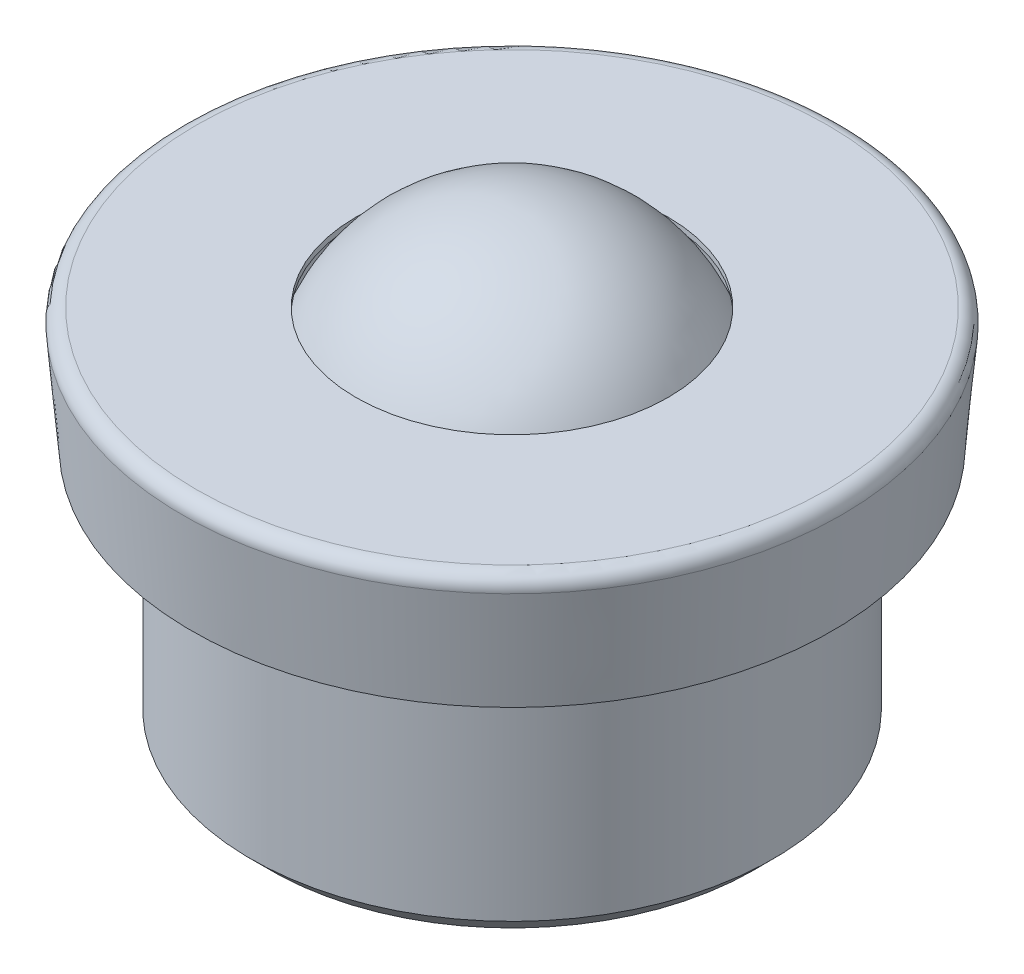
ISO-10303-21;
HEADER;
FILE_DESCRIPTION(('STEP AP214'),'2;1');
FILE_NAME('part.step','',(''),(''),'','','');
FILE_SCHEMA(('AUTOMOTIVE_DESIGN { 1 0 10303 214 1 1 1 1 }'));
ENDSEC;
DATA;
#1=APPLICATION_CONTEXT('core data for automotive mechanical design processes');
#2=APPLICATION_PROTOCOL_DEFINITION('international standard','automotive_design',2000,#1);
#3=PRODUCT_CONTEXT('',#1,'mechanical');
#4=PRODUCT('Part','Part','',(#3));
#5=PRODUCT_RELATED_PRODUCT_CATEGORY('part','',(#4));
#6=PRODUCT_DEFINITION_FORMATION('','',#4);
#7=PRODUCT_DEFINITION_CONTEXT('part definition',#1,'design');
#8=PRODUCT_DEFINITION('design','',#6,#7);
#9=PRODUCT_DEFINITION_SHAPE('','',#8);
#10=(LENGTH_UNIT() NAMED_UNIT(*) SI_UNIT(.MILLI.,.METRE.));
#11=(NAMED_UNIT(*) PLANE_ANGLE_UNIT() SI_UNIT($,.RADIAN.));
#12=(NAMED_UNIT(*) SI_UNIT($,.STERADIAN.) SOLID_ANGLE_UNIT());
#13=UNCERTAINTY_MEASURE_WITH_UNIT(LENGTH_MEASURE(1.E-05),#10,'distance_accuracy_value','');
#14=(GEOMETRIC_REPRESENTATION_CONTEXT(3) GLOBAL_UNCERTAINTY_ASSIGNED_CONTEXT((#13)) GLOBAL_UNIT_ASSIGNED_CONTEXT((#10,
#11,#12)) REPRESENTATION_CONTEXT('',''));
#15=CARTESIAN_POINT('',(0.,0.,0.));
#16=DIRECTION('',(0.,0.,1.));
#17=DIRECTION('',(1.,0.,0.));
#18=AXIS2_PLACEMENT_3D('',#15,#16,#17);
#19=CARTESIAN_POINT('',(0.,-1.5875,0.));
#20=DIRECTION('',(0.,1.,0.));
#21=DIRECTION('',(-1.,0.,0.));
#22=AXIS2_PLACEMENT_3D('',#19,#20,#21);
#23=CONICAL_SURFACE('',#22,14.1045653660544,0.78539816339745);
#24=CARTESIAN_POINT('',(0.,-1.3335,0.));
#25=DIRECTION('',(0.,1.,0.));
#26=DIRECTION('',(-1.,0.,0.));
#27=AXIS2_PLACEMENT_3D('',#24,#25,#26);
#28=CIRCLE('',#27,14.3585653660544);
#29=CARTESIAN_POINT('',(-14.3585653660544,-1.3335,0.));
#30=VERTEX_POINT('',#29);
#31=EDGE_CURVE('E55',#30,#30,#28,.T.);
#32=ORIENTED_EDGE('',*,*,#31,.F.);
#33=EDGE_LOOP('',(#32));
#34=FACE_BOUND('',#33,.T.);
#35=CARTESIAN_POINT('',(0.,-1.5875,0.));
#36=DIRECTION('',(0.,1.,0.));
#37=DIRECTION('',(-1.,0.,0.));
#38=AXIS2_PLACEMENT_3D('',#35,#36,#37);
#39=CIRCLE('',#38,14.1045653660544);
#40=CARTESIAN_POINT('',(-14.1045653660544,-1.5875,0.));
#41=VERTEX_POINT('',#40);
#42=EDGE_CURVE('E70',#41,#41,#39,.T.);
#43=ORIENTED_EDGE('',*,*,#42,.T.);
#44=EDGE_LOOP('',(#43));
#45=FACE_BOUND('',#44,.T.);
#46=ADVANCED_FACE('F44',(#34,#45),#23,.T.);
#47=CARTESIAN_POINT('',(0.,-1.3335,0.));
#48=DIRECTION('',(0.,1.,0.));
#49=DIRECTION('',(-1.,0.,0.));
#50=AXIS2_PLACEMENT_3D('',#47,#48,#49);
#51=CONICAL_SURFACE('',#50,14.3585653660544,0.0872664625997214);
#52=CARTESIAN_POINT('',(0.,3.7585,0.));
#53=DIRECTION('',(0.,1.,0.));
#54=DIRECTION('',(-1.,0.,0.));
#55=AXIS2_PLACEMENT_3D('',#52,#53,#54);
#56=CIRCLE('',#55,14.8040576407284);
#57=CARTESIAN_POINT('',(-14.8040576407284,3.7585,0.));
#58=VERTEX_POINT('',#57);
#59=EDGE_CURVE('E59',#58,#58,#56,.T.);
#60=ORIENTED_EDGE('',*,*,#59,.F.);
#61=EDGE_LOOP('',(#60));
#62=FACE_BOUND('',#61,.T.);
#63=ORIENTED_EDGE('',*,*,#31,.T.);
#64=EDGE_LOOP('',(#63));
#65=FACE_BOUND('',#64,.T.);
#66=ADVANCED_FACE('F98',(#62,#65),#51,.T.);
#67=CARTESIAN_POINT('',(9.78016789221944,3.7585,0.));
#68=DIRECTION('',(0.,-1.,0.));
#69=DIRECTION('',(1.,0.,0.));
#70=AXIS2_PLACEMENT_3D('',#67,#68,#69);
#71=PLANE('',#70);
#72=CARTESIAN_POINT('',(0.,3.7585,0.));
#73=DIRECTION('',(0.,1.,0.));
#74=DIRECTION('',(-1.,0.,0.));
#75=AXIS2_PLACEMENT_3D('',#72,#73,#74);
#76=CIRCLE('',#75,9.78016789221944);
#77=CARTESIAN_POINT('',(9.78016789221944,3.7585,0.));
#78=VERTEX_POINT('',#77);
#79=EDGE_CURVE('E64',#78,#78,#76,.T.);
#80=ORIENTED_EDGE('',*,*,#79,.F.);
#81=EDGE_LOOP('',(#80));
#82=FACE_BOUND('',#81,.T.);
#83=ORIENTED_EDGE('',*,*,#59,.T.);
#84=EDGE_LOOP('',(#83));
#85=FACE_BOUND('',#84,.T.);
#86=ADVANCED_FACE('F94',(#82,#85),#71,.F.);
#87=CARTESIAN_POINT('',(0.,0.,0.));
#88=DIRECTION('',(0.,1.,0.));
#89=DIRECTION('',(1.,0.,0.));
#90=AXIS2_PLACEMENT_3D('',#87,#88,#89);
#91=SPHERICAL_SURFACE('',#90,10.4775);
#92=CARTESIAN_POINT('',(0.,-10.4582398734204,0.));
#93=DIRECTION('',(0.,1.,0.));
#94=DIRECTION('',(-1.,0.,0.));
#95=AXIS2_PLACEMENT_3D('',#92,#93,#94);
#96=CIRCLE('',#95,0.635);
#97=CARTESIAN_POINT('',(0.635000000000021,-10.4582398734204,0.));
#98=VERTEX_POINT('',#97);
#99=EDGE_CURVE('E73',#98,#98,#96,.F.);
#100=CARTESIAN_POINT('',(0.635000000000021,-10.4582398734204,0.));
#101=CARTESIAN_POINT('',(0.839486750809069,-10.4458313385506,0.));
#102=CARTESIAN_POINT('',(1.04360772166766,-10.4274109674214,0.));
#103=CARTESIAN_POINT('',(1.45041985632431,-10.3786422729271,0.));
#104=CARTESIAN_POINT('',(1.65311102012238,-10.3482939495622,0.));
#105=CARTESIAN_POINT('',(2.05636529349838,-10.2757650708801,0.));
#106=CARTESIAN_POINT('',(2.25692840307631,-10.2335845155629,0.));
#107=CARTESIAN_POINT('',(2.65523695866007,-10.13753858698,0.));
#108=CARTESIAN_POINT('',(2.8529824046659,-10.0836732137141,0.));
#109=CARTESIAN_POINT('',(3.24497536271436,-9.96444231037557,0.));
#110=CARTESIAN_POINT('',(3.43922287475699,-9.8990767803028,0.));
#111=CARTESIAN_POINT('',(3.82355182113725,-9.75707057152275,0.));
#112=CARTESIAN_POINT('',(4.01363325547488,-9.68042989281546,0.));
#113=CARTESIAN_POINT('',(4.38897620763533,-9.51613696718456,0.));
#114=CARTESIAN_POINT('',(4.57423772545816,-9.42848472026094,0.));
#115=CARTESIAN_POINT('',(4.93930359190139,-9.24247017237625,0.));
#116=CARTESIAN_POINT('',(5.11910794052179,-9.14410787141517,0.));
#117=CARTESIAN_POINT('',(5.47264098537421,-8.93701155440526,0.));
#118=CARTESIAN_POINT('',(5.64636968160622,-8.82827753835642,0.));
#119=CARTESIAN_POINT('',(5.98715383773568,-8.60081181034217,0.));
#120=CARTESIAN_POINT('',(6.15420929763314,-8.48208009837676,0.));
#121=CARTESIAN_POINT('',(6.48107235131078,-8.23502738622897,0.));
#122=CARTESIAN_POINT('',(6.64087994509096,-8.10670638604658,0.));
#123=CARTESIAN_POINT('',(6.9526975676658,-7.840916490253,0.));
#124=CARTESIAN_POINT('',(7.10470759646045,-7.7034475946418,0.));
#125=CARTESIAN_POINT('',(7.40040721189516,-7.41983476721413,0.));
#126=CARTESIAN_POINT('',(7.5440967985352,-7.27369083539767,0.));
#127=CARTESIAN_POINT('',(7.82266127277172,-6.97323063479805,0.));
#128=CARTESIAN_POINT('',(7.95753616036819,-6.81891436601489,0.));
#129=CARTESIAN_POINT('',(8.21800730002785,-6.50264030154696,0.));
#130=CARTESIAN_POINT('',(8.34360355209103,-6.34068250586219,0.));
#131=CARTESIAN_POINT('',(8.58508540042208,-6.00968248263351,0.));
#132=CARTESIAN_POINT('',(8.70097099668995,-5.84064025508959,0.));
#133=CARTESIAN_POINT('',(8.92263291543938,-5.4960528318904,0.));
#134=CARTESIAN_POINT('',(9.02840923792094,-5.32050763623513,0.));
#135=CARTESIAN_POINT('',(9.22948876452597,-4.96351810917437,0.));
#136=CARTESIAN_POINT('',(9.32479196864944,-4.78207377776887,0.));
#137=CARTESIAN_POINT('',(9.50459743892121,-4.41391010314709,0.));
#138=CARTESIAN_POINT('',(9.5890997050695,-4.22719075993081,0.));
#139=CARTESIAN_POINT('',(9.7470126323493,-3.84911933037158,0.));
#140=CARTESIAN_POINT('',(9.82042329348081,-3.65776724402864,0.));
#141=CARTESIAN_POINT('',(9.95590049607734,-3.27108853240055,0.));
#142=CARTESIAN_POINT('',(10.0179670375424,-3.07576190711539,0.));
#143=CARTESIAN_POINT('',(10.130542507162,-2.68180599321879,0.));
#144=CARTESIAN_POINT('',(10.1810514353166,-2.48317670460733,0.));
#145=CARTESIAN_POINT('',(10.2703379399477,-2.08329870004868,0.));
#146=CARTESIAN_POINT('',(10.3091155164242,-1.88204998410148,0.));
#147=CARTESIAN_POINT('',(10.3748059325805,-1.47762537095938,0.));
#148=CARTESIAN_POINT('',(10.4017187722603,-1.27444947376448,0.));
#149=CARTESIAN_POINT('',(10.443587140439,-0.866869373578338,0.));
#150=CARTESIAN_POINT('',(10.4585426689379,-0.662465170587094,0.));
#151=CARTESIAN_POINT('',(10.4764449744892,-0.253131558086676,0.));
#152=CARTESIAN_POINT('',(10.4793917515416,-0.0482021485775037,0.));
#153=CARTESIAN_POINT('',(10.4732664065175,0.361476966459155,0.));
#154=CARTESIAN_POINT('',(10.464194284441,0.566226671986641,0.));
#155=CARTESIAN_POINT('',(10.4340623899239,0.974842104013692,0.));
#156=CARTESIAN_POINT('',(10.4130026174832,1.17870783051326,0.));
#157=CARTESIAN_POINT('',(10.3589677026046,1.58485400548549,0.));
#158=CARTESIAN_POINT('',(10.3259925601667,1.78713445395817,0.));
#159=CARTESIAN_POINT('',(10.2482409291056,2.1894144680229,0.));
#160=CARTESIAN_POINT('',(10.2034644404824,2.38941403361495,0.));
#161=CARTESIAN_POINT('',(10.1022619075717,2.78644362265254,0.));
#162=CARTESIAN_POINT('',(10.0458358632843,2.98347364609807,0.));
#163=CARTESIAN_POINT('',(9.92153663177256,3.37388906525077,0.));
#164=CARTESIAN_POINT('',(9.85366344454832,3.56727446095794,0.));
#165=CARTESIAN_POINT('',(9.78016789221944,3.7585,0.));
#166=B_SPLINE_CURVE_WITH_KNOTS('',3,(#100,#101,#102,#103,#104,#105,#106,#107,#108,#109,#110,
#111,#112,#113,#114,#115,#116,#117,#118,#119,#120,#121,#122,#123,#124,#125,#126,#127,#128,#129,
#130,#131,#132,#133,#134,#135,#136,#137,#138,#139,#140,#141,#142,#143,#144,#145,#146,#147,#148,
#149,#150,#151,#152,#153,#154,#155,#156,#157,#158,#159,#160,#161,#162,#163,#164,#165),
.UNSPECIFIED.,.F.,.F.,(4,2,2,2,2,2,2,2,2,2,2,2,2,2,2,2,2,2,2,2,2,2,2,2,2,2,2,2,2,2,2,2,4),(0.,
0.614499293128332,1.22899858625666,1.84349787938499,2.45799717251332,3.07249646564166,
3.68699575876999,4.30149505189832,4.91599434502665,5.53049363815498,6.14499293128331,
6.75949222441164,7.37399151753998,7.98849081066831,8.60299010379664,9.21748939692497,
9.8319886900533,10.4464879831816,11.06098727631,11.6754865694383,12.2899858625666,
12.904485155695,13.5189844488233,14.1334837419516,14.7479830350799,15.3624823282083,
15.9769816213366,16.5914809144649,17.2059802075933,17.8204795007216,18.4349787938499,
19.0494780869783,19.6639773801066),.UNSPECIFIED.);
#167=EDGE_CURVE('BSEAM86',#98,#78,#166,.T.);
#168=ORIENTED_EDGE('',*,*,#99,.T.);
#169=ORIENTED_EDGE('',*,*,#79,.T.);
#170=ORIENTED_EDGE('',*,*,#167,.T.);
#171=ORIENTED_EDGE('',*,*,#167,.F.);
#172=EDGE_LOOP('',(#168,#170,#169,#171));
#173=FACE_BOUND('',#172,.T.);
#174=ADVANCED_FACE('F86',(#173),#91,.F.);
#175=CARTESIAN_POINT('',(11.90625,-12.7,0.));
#176=DIRECTION('',(0.,1.,0.));
#177=DIRECTION('',(-1.,0.,0.));
#178=AXIS2_PLACEMENT_3D('',#175,#176,#177);
#179=PLANE('',#178);
#180=CARTESIAN_POINT('',(0.,-12.7,0.));
#181=DIRECTION('',(0.,1.,0.));
#182=DIRECTION('',(-1.,0.,0.));
#183=AXIS2_PLACEMENT_3D('',#180,#181,#182);
#184=CIRCLE('',#183,11.01725);
#185=CARTESIAN_POINT('',(-11.01725,-12.7,0.));
#186=VERTEX_POINT('',#185);
#187=EDGE_CURVE('E12',#186,#186,#184,.F.);
#188=ORIENTED_EDGE('',*,*,#187,.T.);
#189=EDGE_LOOP('',(#188));
#190=FACE_BOUND('',#189,.T.);
#191=CARTESIAN_POINT('',(0.,-12.7,0.));
#192=DIRECTION('',(0.,-1.,0.));
#193=DIRECTION('',(1.,0.,0.));
#194=AXIS2_PLACEMENT_3D('',#191,#192,#193);
#195=CIRCLE('',#194,0.635);
#196=CARTESIAN_POINT('',(0.635000000000002,-12.7,0.));
#197=VERTEX_POINT('',#196);
#198=EDGE_CURVE('E76',#197,#197,#195,.T.);
#199=ORIENTED_EDGE('',*,*,#198,.F.);
#200=EDGE_LOOP('',(#199));
#201=FACE_BOUND('',#200,.T.);
#202=ADVANCED_FACE('F83',(#190,#201),#179,.F.);
#203=CARTESIAN_POINT('',(0.,0.,0.));
#204=DIRECTION('',(0.,1.,0.));
#205=DIRECTION('',(-1.,0.,0.));
#206=AXIS2_PLACEMENT_3D('',#203,#204,#205);
#207=CYLINDRICAL_SURFACE('',#206,11.90625);
#208=CARTESIAN_POINT('',(0.,-11.811,0.));
#209=DIRECTION('',(0.,1.,0.));
#210=DIRECTION('',(-1.,0.,0.));
#211=AXIS2_PLACEMENT_3D('',#208,#209,#210);
#212=CIRCLE('',#211,11.90625);
#213=CARTESIAN_POINT('',(-11.90625,-11.811,0.));
#214=VERTEX_POINT('',#213);
#215=EDGE_CURVE('E51',#214,#214,#212,.T.);
#216=ORIENTED_EDGE('',*,*,#215,.T.);
#217=EDGE_LOOP('',(#216));
#218=FACE_BOUND('',#217,.T.);
#219=CARTESIAN_POINT('',(0.,-1.5875,0.));
#220=DIRECTION('',(0.,1.,0.));
#221=DIRECTION('',(-1.,0.,0.));
#222=AXIS2_PLACEMENT_3D('',#219,#220,#221);
#223=CIRCLE('',#222,11.90625);
#224=CARTESIAN_POINT('',(-11.90625,-1.5875,0.));
#225=VERTEX_POINT('',#224);
#226=EDGE_CURVE('E67',#225,#225,#223,.T.);
#227=ORIENTED_EDGE('',*,*,#226,.F.);
#228=EDGE_LOOP('',(#227));
#229=FACE_BOUND('',#228,.T.);
#230=ADVANCED_FACE('F85',(#218,#229),#207,.T.);
#231=CARTESIAN_POINT('',(11.90625,-1.5875,0.));
#232=DIRECTION('',(0.,1.,0.));
#233=DIRECTION('',(-1.,0.,0.));
#234=AXIS2_PLACEMENT_3D('',#231,#232,#233);
#235=PLANE('',#234);
#236=ORIENTED_EDGE('',*,*,#42,.F.);
#237=EDGE_LOOP('',(#236));
#238=FACE_BOUND('',#237,.T.);
#239=ORIENTED_EDGE('',*,*,#226,.T.);
#240=EDGE_LOOP('',(#239));
#241=FACE_BOUND('',#240,.T.);
#242=ADVANCED_FACE('F92',(#238,#241),#235,.F.);
#243=CARTESIAN_POINT('',(0.,7.93750000000001,0.));
#244=DIRECTION('',(0.,-1.,0.));
#245=DIRECTION('',(1.,0.,0.));
#246=AXIS2_PLACEMENT_3D('',#243,#244,#245);
#247=CYLINDRICAL_SURFACE('',#246,0.635);
#248=ORIENTED_EDGE('',*,*,#198,.T.);
#249=EDGE_LOOP('',(#248));
#250=FACE_BOUND('',#249,.T.);
#251=ORIENTED_EDGE('',*,*,#99,.F.);
#252=EDGE_LOOP('',(#251));
#253=FACE_BOUND('',#252,.T.);
#254=ADVANCED_FACE('F80',(#250,#253),#247,.F.);
#255=CARTESIAN_POINT('',(0.,-11.811,0.));
#256=DIRECTION('',(0.,1.,0.));
#257=DIRECTION('',(-1.,0.,0.));
#258=AXIS2_PLACEMENT_3D('',#255,#256,#257);
#259=CONICAL_SURFACE('',#258,11.90625,0.785398163397454);
#260=ORIENTED_EDGE('',*,*,#187,.F.);
#261=EDGE_LOOP('',(#260));
#262=FACE_BOUND('',#261,.T.);
#263=ORIENTED_EDGE('',*,*,#215,.F.);
#264=EDGE_LOOP('',(#263));
#265=FACE_BOUND('',#264,.T.);
#266=ADVANCED_FACE('F46',(#262,#265),#259,.T.);
#267=CLOSED_SHELL('',(#46,#66,#86,#174,#202,#230,#242,#254,#266));
#268=MANIFOLD_SOLID_BREP('B2',#267);
#269=CARTESIAN_POINT('',(7.11825053191487,3.7585,0.));
#270=DIRECTION('',(0.,1.,0.));
#271=DIRECTION('',(-1.,0.,0.));
#272=AXIS2_PLACEMENT_3D('',#269,#270,#271);
#273=PLANE('',#272);
#274=CARTESIAN_POINT('',(0.,3.7585,0.));
#275=DIRECTION('',(0.,1.,0.));
#276=DIRECTION('',(-1.,0.,0.));
#277=AXIS2_PLACEMENT_3D('',#274,#275,#276);
#278=CIRCLE('',#277,14.8040576407284);
#279=CARTESIAN_POINT('',(-14.8040576407284,3.7585,0.));
#280=VERTEX_POINT('',#279);
#281=EDGE_CURVE('E211',#280,#280,#278,.T.);
#282=ORIENTED_EDGE('',*,*,#281,.F.);
#283=EDGE_LOOP('',(#282));
#284=FACE_BOUND('',#283,.T.);
#285=CARTESIAN_POINT('',(0.,3.7585,0.));
#286=DIRECTION('',(0.,1.,0.));
#287=DIRECTION('',(-1.,0.,0.));
#288=AXIS2_PLACEMENT_3D('',#285,#286,#287);
#289=CIRCLE('',#288,7.11825053191487);
#290=CARTESIAN_POINT('',(-7.11825053191487,3.7585,0.));
#291=VERTEX_POINT('',#290);
#292=EDGE_CURVE('E196',#291,#291,#289,.T.);
#293=ORIENTED_EDGE('',*,*,#292,.T.);
#294=EDGE_LOOP('',(#293));
#295=FACE_BOUND('',#294,.T.);
#296=ADVANCED_FACE('F185',(#284,#295),#273,.F.);
#297=CARTESIAN_POINT('',(0.,0.,0.));
#298=DIRECTION('',(0.,1.,0.));
#299=DIRECTION('',(-1.,0.,0.));
#300=AXIS2_PLACEMENT_3D('',#297,#298,#299);
#301=CYLINDRICAL_SURFACE('',#300,7.11825053191487);
#302=ORIENTED_EDGE('',*,*,#292,.F.);
#303=EDGE_LOOP('',(#302));
#304=FACE_BOUND('',#303,.T.);
#305=CARTESIAN_POINT('',(0.,4.0125,0.));
#306=DIRECTION('',(0.,1.,0.));
#307=DIRECTION('',(-1.,0.,0.));
#308=AXIS2_PLACEMENT_3D('',#305,#306,#307);
#309=CIRCLE('',#308,7.11825053191487);
#310=CARTESIAN_POINT('',(-7.11825053191487,4.0125,0.));
#311=VERTEX_POINT('',#310);
#312=EDGE_CURVE('E200',#311,#311,#309,.T.);
#313=ORIENTED_EDGE('',*,*,#312,.T.);
#314=EDGE_LOOP('',(#313));
#315=FACE_BOUND('',#314,.T.);
#316=ADVANCED_FACE('F219',(#304,#315),#301,.F.);
#317=CARTESIAN_POINT('',(7.11825053191487,4.0125,0.));
#318=DIRECTION('',(0.,-1.,0.));
#319=DIRECTION('',(1.,0.,0.));
#320=AXIS2_PLACEMENT_3D('',#317,#318,#319);
#321=PLANE('',#320);
#322=CARTESIAN_POINT('',(0.,4.0125,0.));
#323=DIRECTION('',(0.,-1.,0.));
#324=DIRECTION('',(1.,0.,0.));
#325=AXIS2_PLACEMENT_3D('',#322,#323,#324);
#326=CIRCLE('',#325,14.388269101821);
#327=CARTESIAN_POINT('',(14.388269101821,4.0125,0.));
#328=VERTEX_POINT('',#327);
#329=EDGE_CURVE('E192',#328,#328,#326,.F.);
#330=ORIENTED_EDGE('',*,*,#329,.T.);
#331=EDGE_LOOP('',(#330));
#332=FACE_BOUND('',#331,.T.);
#333=ORIENTED_EDGE('',*,*,#312,.F.);
#334=EDGE_LOOP('',(#333));
#335=FACE_BOUND('',#334,.T.);
#336=ADVANCED_FACE('F224',(#332,#335),#321,.F.);
#337=CARTESIAN_POINT('',(0.,-1.4605,0.));
#338=DIRECTION('',(0.,1.,0.));
#339=DIRECTION('',(-1.,0.,0.));
#340=AXIS2_PLACEMENT_3D('',#337,#338,#339);
#341=CONICAL_SURFACE('',#340,14.6024245445226,0.0872664625997193);
#342=CARTESIAN_POINT('',(0.,3.32215610335523,0.));
#343=DIRECTION('',(0.,-1.,0.));
#344=DIRECTION('',(1.,0.,0.));
#345=AXIS2_PLACEMENT_3D('',#342,#343,#344);
#346=CIRCLE('',#345,15.0208527351093);
#347=CARTESIAN_POINT('',(15.0208527351093,3.32215610335524,0.));
#348=VERTEX_POINT('',#347);
#349=EDGE_CURVE('E43',#348,#348,#346,.T.);
#350=ORIENTED_EDGE('',*,*,#349,.T.);
#351=EDGE_LOOP('',(#350));
#352=FACE_BOUND('',#351,.T.);
#353=CARTESIAN_POINT('',(0.,-1.4605,0.));
#354=DIRECTION('',(0.,1.,0.));
#355=DIRECTION('',(-1.,0.,0.));
#356=AXIS2_PLACEMENT_3D('',#353,#354,#355);
#357=CIRCLE('',#356,14.6024245445226);
#358=CARTESIAN_POINT('',(-14.6024245445226,-1.4605,0.));
#359=VERTEX_POINT('',#358);
#360=EDGE_CURVE('E205',#359,#359,#357,.T.);
#361=ORIENTED_EDGE('',*,*,#360,.T.);
#362=EDGE_LOOP('',(#361));
#363=FACE_BOUND('',#362,.T.);
#364=ADVANCED_FACE('F229',(#352,#363),#341,.T.);
#365=CARTESIAN_POINT('',(14.6024245445226,-1.4605,0.));
#366=DIRECTION('',(0.,1.,0.));
#367=DIRECTION('',(-1.,0.,0.));
#368=AXIS2_PLACEMENT_3D('',#365,#366,#367);
#369=PLANE('',#368);
#370=ORIENTED_EDGE('',*,*,#360,.F.);
#371=EDGE_LOOP('',(#370));
#372=FACE_BOUND('',#371,.T.);
#373=CARTESIAN_POINT('',(0.,-1.4605,0.));
#374=DIRECTION('',(0.,1.,0.));
#375=DIRECTION('',(-1.,0.,0.));
#376=AXIS2_PLACEMENT_3D('',#373,#374,#375);
#377=CIRCLE('',#376,14.3474543057866);
#378=CARTESIAN_POINT('',(-14.3474543057866,-1.4605,0.));
#379=VERTEX_POINT('',#378);
#380=EDGE_CURVE('E208',#379,#379,#377,.T.);
#381=ORIENTED_EDGE('',*,*,#380,.T.);
#382=EDGE_LOOP('',(#381));
#383=FACE_BOUND('',#382,.T.);
#384=ADVANCED_FACE('F234',(#372,#383),#369,.F.);
#385=CARTESIAN_POINT('',(0.,3.7585,0.));
#386=DIRECTION('',(0.,1.,0.));
#387=DIRECTION('',(-1.,0.,0.));
#388=AXIS2_PLACEMENT_3D('',#385,#386,#387);
#389=CONICAL_SURFACE('',#388,14.8040576407284,0.0872664625997214);
#390=ORIENTED_EDGE('',*,*,#380,.F.);
#391=EDGE_LOOP('',(#390));
#392=FACE_BOUND('',#391,.T.);
#393=ORIENTED_EDGE('',*,*,#281,.T.);
#394=EDGE_LOOP('',(#393));
#395=FACE_BOUND('',#394,.T.);
#396=ADVANCED_FACE('F215',(#392,#395),#389,.F.);
#397=CARTESIAN_POINT('',(0.,3.3775,0.));
#398=DIRECTION('',(0.,-1.,0.));
#399=DIRECTION('',(1.,0.,0.));
#400=AXIS2_PLACEMENT_3D('',#397,#398,#399);
#401=TOROIDAL_SURFACE('',#400,14.388269101821,0.635);
#402=ORIENTED_EDGE('',*,*,#349,.F.);
#403=EDGE_LOOP('',(#402));
#404=FACE_BOUND('',#403,.T.);
#405=ORIENTED_EDGE('',*,*,#329,.F.);
#406=EDGE_LOOP('',(#405));
#407=FACE_BOUND('',#406,.T.);
#408=ADVANCED_FACE('F187',(#404,#407),#401,.T.);
#409=CLOSED_SHELL('',(#296,#316,#336,#364,#384,#396,#408));
#410=MANIFOLD_SOLID_BREP('B7',#409);
#411=CARTESIAN_POINT('',(0.,0.,0.));
#412=DIRECTION('',(0.,-1.,0.));
#413=DIRECTION('',(-1.,0.,0.));
#414=AXIS2_PLACEMENT_3D('',#411,#412,#413);
#415=SPHERICAL_SURFACE('',#414,7.9375);
#416=CARTESIAN_POINT('',(0.,-7.9375,0.));
#417=VERTEX_POINT('',#416);
#418=VERTEX_LOOP('',#417);
#419=FACE_BOUND('',#418,.T.);
#420=ADVANCED_FACE('F294',(#419),#415,.T.);
#421=CLOSED_SHELL('',(#420));
#422=MANIFOLD_SOLID_BREP('B38',#421);
#423=ADVANCED_BREP_SHAPE_REPRESENTATION('',(#18,#268,#410,#422),#14);
#424=SHAPE_DEFINITION_REPRESENTATION(#9,#423);
ENDSEC;
END-ISO-10303-21;
